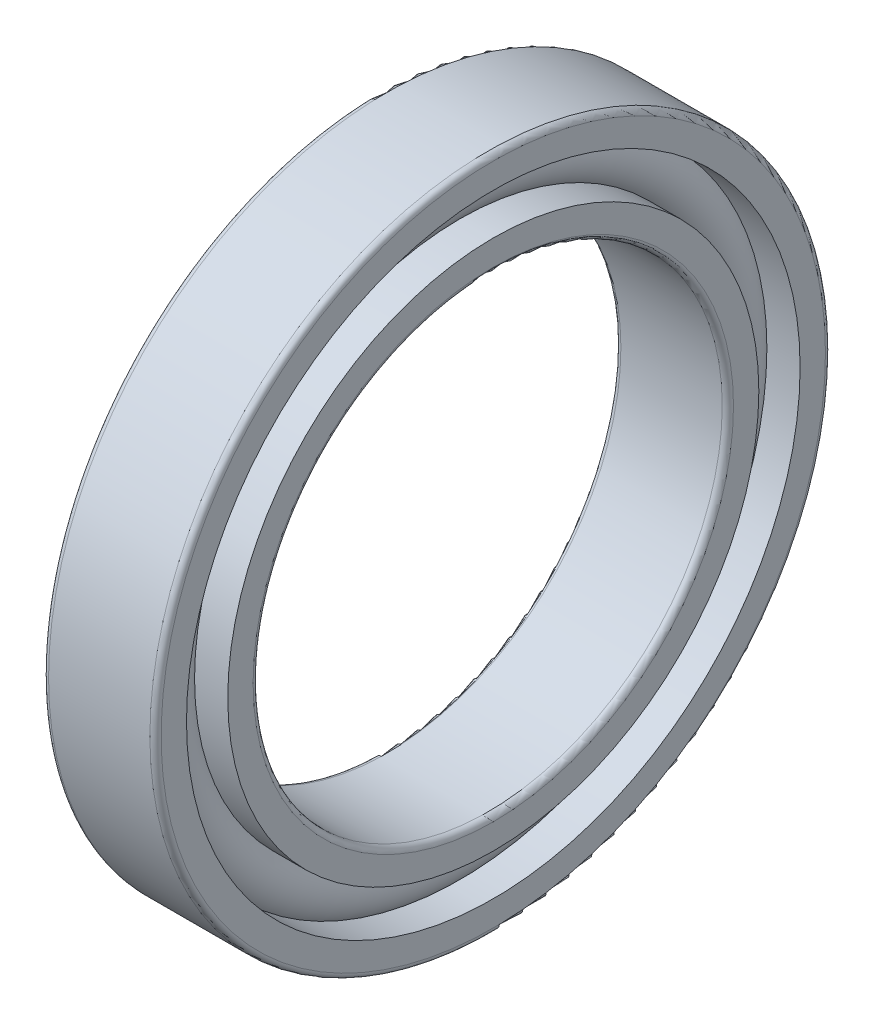
ISO-10303-21;
HEADER;
FILE_DESCRIPTION(('STEP AP214'),'2;1');
FILE_NAME('part.step','',(''),(''),'','','');
FILE_SCHEMA(('AUTOMOTIVE_DESIGN { 1 0 10303 214 1 1 1 1 }'));
ENDSEC;
DATA;
#1=APPLICATION_CONTEXT('core data for automotive mechanical design processes');
#2=APPLICATION_PROTOCOL_DEFINITION('international standard','automotive_design',2000,#1);
#3=PRODUCT_CONTEXT('',#1,'mechanical');
#4=PRODUCT('Part','Part','',(#3));
#5=PRODUCT_RELATED_PRODUCT_CATEGORY('part','',(#4));
#6=PRODUCT_DEFINITION_FORMATION('','',#4);
#7=PRODUCT_DEFINITION_CONTEXT('part definition',#1,'design');
#8=PRODUCT_DEFINITION('design','',#6,#7);
#9=PRODUCT_DEFINITION_SHAPE('','',#8);
#10=(LENGTH_UNIT() NAMED_UNIT(*) SI_UNIT(.MILLI.,.METRE.));
#11=(NAMED_UNIT(*) PLANE_ANGLE_UNIT() SI_UNIT($,.RADIAN.));
#12=(NAMED_UNIT(*) SI_UNIT($,.STERADIAN.) SOLID_ANGLE_UNIT());
#13=UNCERTAINTY_MEASURE_WITH_UNIT(LENGTH_MEASURE(1.E-05),#10,'distance_accuracy_value','');
#14=(GEOMETRIC_REPRESENTATION_CONTEXT(3) GLOBAL_UNCERTAINTY_ASSIGNED_CONTEXT((#13)) GLOBAL_UNIT_ASSIGNED_CONTEXT((#10,
#11,#12)) REPRESENTATION_CONTEXT('',''));
#15=CARTESIAN_POINT('',(0.,0.,0.));
#16=DIRECTION('',(0.,0.,1.));
#17=DIRECTION('',(1.,0.,0.));
#18=AXIS2_PLACEMENT_3D('',#15,#16,#17);
#19=CARTESIAN_POINT('',(0.,0.,0.));
#20=DIRECTION('',(-1.,0.,0.));
#21=DIRECTION('',(0.,0.,1.));
#22=AXIS2_PLACEMENT_3D('',#19,#20,#21);
#23=TOROIDAL_SURFACE('',#22,30.5,3.3);
#24=CARTESIAN_POINT('',(2.45967477524976,0.,0.));
#25=DIRECTION('',(-1.,0.,0.));
#26=DIRECTION('',(0.,0.,1.));
#27=AXIS2_PLACEMENT_3D('',#24,#25,#26);
#28=CIRCLE('',#27,32.7);
#29=CARTESIAN_POINT('',(2.45967477524976,0.,32.7));
#30=VERTEX_POINT('',#29);
#31=EDGE_CURVE('E36',#30,#30,#28,.F.);
#32=ORIENTED_EDGE('',*,*,#31,.T.);
#33=EDGE_LOOP('',(#32));
#34=FACE_BOUND('',#33,.T.);
#35=CARTESIAN_POINT('',(2.45967477524977,0.,0.));
#36=DIRECTION('',(-1.,0.,0.));
#37=DIRECTION('',(0.,0.,1.));
#38=AXIS2_PLACEMENT_3D('',#35,#36,#37);
#39=CIRCLE('',#38,28.3);
#40=CARTESIAN_POINT('',(2.45967477524977,0.,28.3));
#41=VERTEX_POINT('',#40);
#42=EDGE_CURVE('E10',#41,#41,#39,.T.);
#43=ORIENTED_EDGE('',*,*,#42,.T.);
#44=EDGE_LOOP('',(#43));
#45=FACE_BOUND('',#44,.T.);
#46=ADVANCED_FACE('F32',(#34,#45),#23,.T.);
#47=CARTESIAN_POINT('',(-20.6375,0.,0.));
#48=DIRECTION('',(1.,0.,0.));
#49=DIRECTION('',(0.,0.,-1.));
#50=AXIS2_PLACEMENT_3D('',#47,#48,#49);
#51=CYLINDRICAL_SURFACE('',#50,28.3);
#52=CARTESIAN_POINT('',(6.,0.,0.));
#53=DIRECTION('',(1.,0.,0.));
#54=DIRECTION('',(0.,0.,-1.));
#55=AXIS2_PLACEMENT_3D('',#52,#53,#54);
#56=CIRCLE('',#55,28.3);
#57=CARTESIAN_POINT('',(6.,0.,-28.3));
#58=VERTEX_POINT('',#57);
#59=EDGE_CURVE('E45',#58,#58,#56,.T.);
#60=ORIENTED_EDGE('',*,*,#59,.F.);
#61=EDGE_LOOP('',(#60));
#62=FACE_BOUND('',#61,.T.);
#63=ORIENTED_EDGE('',*,*,#42,.F.);
#64=EDGE_LOOP('',(#63));
#65=FACE_BOUND('',#64,.T.);
#66=ADVANCED_FACE('F84',(#62,#65),#51,.T.);
#67=CARTESIAN_POINT('',(-20.6375,0.,0.));
#68=DIRECTION('',(1.,0.,0.));
#69=DIRECTION('',(0.,0.,-1.));
#70=AXIS2_PLACEMENT_3D('',#67,#68,#69);
#71=CYLINDRICAL_SURFACE('',#70,28.3);
#72=CARTESIAN_POINT('',(-6.,0.,0.));
#73=DIRECTION('',(1.,0.,0.));
#74=DIRECTION('',(0.,0.,-1.));
#75=AXIS2_PLACEMENT_3D('',#72,#73,#74);
#76=CIRCLE('',#75,28.3);
#77=CARTESIAN_POINT('',(-6.,0.,-28.3));
#78=VERTEX_POINT('',#77);
#79=EDGE_CURVE('E54',#78,#78,#76,.T.);
#80=ORIENTED_EDGE('',*,*,#79,.T.);
#81=EDGE_LOOP('',(#80));
#82=FACE_BOUND('',#81,.T.);
#83=CARTESIAN_POINT('',(-2.45967477524977,0.,0.));
#84=DIRECTION('',(1.,0.,0.));
#85=DIRECTION('',(0.,0.,-1.));
#86=AXIS2_PLACEMENT_3D('',#83,#84,#85);
#87=CIRCLE('',#86,28.3);
#88=CARTESIAN_POINT('',(-2.45967477524977,0.,-28.3));
#89=VERTEX_POINT('',#88);
#90=EDGE_CURVE('E40',#89,#89,#87,.T.);
#91=ORIENTED_EDGE('',*,*,#90,.F.);
#92=EDGE_LOOP('',(#91));
#93=FACE_BOUND('',#92,.T.);
#94=ADVANCED_FACE('F87',(#82,#93),#71,.T.);
#95=CARTESIAN_POINT('',(6.,25.6,0.));
#96=DIRECTION('',(1.,0.,0.));
#97=DIRECTION('',(0.,0.,-1.));
#98=AXIS2_PLACEMENT_3D('',#95,#96,#97);
#99=PLANE('',#98);
#100=ORIENTED_EDGE('',*,*,#59,.T.);
#101=EDGE_LOOP('',(#100));
#102=FACE_BOUND('',#101,.T.);
#103=CARTESIAN_POINT('',(6.,0.,0.));
#104=DIRECTION('',(1.,0.,0.));
#105=DIRECTION('',(0.,0.,-1.));
#106=AXIS2_PLACEMENT_3D('',#103,#104,#105);
#107=CIRCLE('',#106,25.6);
#108=CARTESIAN_POINT('',(6.,0.,-25.6));
#109=VERTEX_POINT('',#108);
#110=EDGE_CURVE('E76',#109,#109,#107,.T.);
#111=ORIENTED_EDGE('',*,*,#110,.F.);
#112=EDGE_LOOP('',(#111));
#113=FACE_BOUND('',#112,.T.);
#114=ADVANCED_FACE('F81',(#102,#113),#99,.T.);
#115=CARTESIAN_POINT('',(5.4,0.,0.));
#116=DIRECTION('',(1.,0.,0.));
#117=DIRECTION('',(0.,0.,-1.));
#118=AXIS2_PLACEMENT_3D('',#115,#116,#117);
#119=TOROIDAL_SURFACE('',#118,25.6,0.6);
#120=ORIENTED_EDGE('',*,*,#110,.T.);
#121=EDGE_LOOP('',(#120));
#122=FACE_BOUND('',#121,.T.);
#123=CARTESIAN_POINT('',(5.4,0.,0.));
#124=DIRECTION('',(1.,0.,0.));
#125=DIRECTION('',(0.,0.,-1.));
#126=AXIS2_PLACEMENT_3D('',#123,#124,#125);
#127=CIRCLE('',#126,25.);
#128=CARTESIAN_POINT('',(5.4,0.,-25.));
#129=VERTEX_POINT('',#128);
#130=EDGE_CURVE('E73',#129,#129,#127,.T.);
#131=ORIENTED_EDGE('',*,*,#130,.F.);
#132=EDGE_LOOP('',(#131));
#133=FACE_BOUND('',#132,.T.);
#134=ADVANCED_FACE('F98',(#122,#133),#119,.T.);
#135=CARTESIAN_POINT('',(-20.6375,0.,0.));
#136=DIRECTION('',(1.,0.,0.));
#137=DIRECTION('',(0.,0.,-1.));
#138=AXIS2_PLACEMENT_3D('',#135,#136,#137);
#139=CYLINDRICAL_SURFACE('',#138,25.);
#140=ORIENTED_EDGE('',*,*,#130,.T.);
#141=EDGE_LOOP('',(#140));
#142=FACE_BOUND('',#141,.T.);
#143=CARTESIAN_POINT('',(-5.4,0.,0.));
#144=DIRECTION('',(1.,0.,0.));
#145=DIRECTION('',(0.,0.,-1.));
#146=AXIS2_PLACEMENT_3D('',#143,#144,#145);
#147=CIRCLE('',#146,25.);
#148=CARTESIAN_POINT('',(-5.4,0.,-25.));
#149=VERTEX_POINT('',#148);
#150=EDGE_CURVE('E70',#149,#149,#147,.T.);
#151=ORIENTED_EDGE('',*,*,#150,.F.);
#152=EDGE_LOOP('',(#151));
#153=FACE_BOUND('',#152,.T.);
#154=ADVANCED_FACE('F101',(#142,#153),#139,.F.);
#155=CARTESIAN_POINT('',(-5.4,0.,0.));
#156=DIRECTION('',(1.,0.,0.));
#157=DIRECTION('',(0.,0.,-1.));
#158=AXIS2_PLACEMENT_3D('',#155,#156,#157);
#159=TOROIDAL_SURFACE('',#158,25.6,0.6);
#160=ORIENTED_EDGE('',*,*,#150,.T.);
#161=EDGE_LOOP('',(#160));
#162=FACE_BOUND('',#161,.T.);
#163=CARTESIAN_POINT('',(-6.,0.,0.));
#164=DIRECTION('',(1.,0.,0.));
#165=DIRECTION('',(0.,0.,-1.));
#166=AXIS2_PLACEMENT_3D('',#163,#164,#165);
#167=CIRCLE('',#166,25.6);
#168=CARTESIAN_POINT('',(-6.,0.,-25.6));
#169=VERTEX_POINT('',#168);
#170=EDGE_CURVE('E67',#169,#169,#167,.T.);
#171=ORIENTED_EDGE('',*,*,#170,.F.);
#172=EDGE_LOOP('',(#171));
#173=FACE_BOUND('',#172,.T.);
#174=ADVANCED_FACE('F105',(#162,#173),#159,.T.);
#175=CARTESIAN_POINT('',(-6.,28.3,0.));
#176=DIRECTION('',(-1.,0.,0.));
#177=DIRECTION('',(0.,0.,1.));
#178=AXIS2_PLACEMENT_3D('',#175,#176,#177);
#179=PLANE('',#178);
#180=ORIENTED_EDGE('',*,*,#170,.T.);
#181=EDGE_LOOP('',(#180));
#182=FACE_BOUND('',#181,.T.);
#183=ORIENTED_EDGE('',*,*,#79,.F.);
#184=EDGE_LOOP('',(#183));
#185=FACE_BOUND('',#184,.T.);
#186=ADVANCED_FACE('F109',(#182,#185),#179,.T.);
#187=CARTESIAN_POINT('',(-2.45967477524976,0.,0.));
#188=DIRECTION('',(1.,0.,0.));
#189=DIRECTION('',(0.,0.,-1.));
#190=AXIS2_PLACEMENT_3D('',#187,#188,#189);
#191=CIRCLE('',#190,32.7);
#192=CARTESIAN_POINT('',(-2.45967477524976,0.,-32.7));
#193=VERTEX_POINT('',#192);
#194=EDGE_CURVE('E48',#193,#193,#191,.F.);
#195=ORIENTED_EDGE('',*,*,#194,.T.);
#196=EDGE_LOOP('',(#195));
#197=FACE_BOUND('',#196,.T.);
#198=ORIENTED_EDGE('',*,*,#90,.T.);
#199=EDGE_LOOP('',(#198));
#200=FACE_BOUND('',#199,.T.);
#201=ADVANCED_FACE('F34',(#197,#200),#23,.T.);
#202=CARTESIAN_POINT('',(-20.6375,0.,0.));
#203=DIRECTION('',(1.,0.,0.));
#204=DIRECTION('',(0.,0.,-1.));
#205=AXIS2_PLACEMENT_3D('',#202,#203,#204);
#206=CYLINDRICAL_SURFACE('',#205,32.7);
#207=CARTESIAN_POINT('',(6.,0.,0.));
#208=DIRECTION('',(1.,0.,0.));
#209=DIRECTION('',(0.,0.,-1.));
#210=AXIS2_PLACEMENT_3D('',#207,#208,#209);
#211=CIRCLE('',#210,32.7);
#212=CARTESIAN_POINT('',(6.,0.,-32.7));
#213=VERTEX_POINT('',#212);
#214=EDGE_CURVE('E50',#213,#213,#211,.T.);
#215=ORIENTED_EDGE('',*,*,#214,.T.);
#216=EDGE_LOOP('',(#215));
#217=FACE_BOUND('',#216,.T.);
#218=ORIENTED_EDGE('',*,*,#31,.F.);
#219=EDGE_LOOP('',(#218));
#220=FACE_BOUND('',#219,.T.);
#221=ADVANCED_FACE('F114',(#217,#220),#206,.F.);
#222=CARTESIAN_POINT('',(-20.6375,0.,0.));
#223=DIRECTION('',(1.,0.,0.));
#224=DIRECTION('',(0.,0.,-1.));
#225=AXIS2_PLACEMENT_3D('',#222,#223,#224);
#226=CYLINDRICAL_SURFACE('',#225,32.7);
#227=CARTESIAN_POINT('',(-6.,0.,0.));
#228=DIRECTION('',(1.,0.,0.));
#229=DIRECTION('',(0.,0.,-1.));
#230=AXIS2_PLACEMENT_3D('',#227,#228,#229);
#231=CIRCLE('',#230,32.7);
#232=CARTESIAN_POINT('',(-6.,0.,-32.7));
#233=VERTEX_POINT('',#232);
#234=EDGE_CURVE('E145',#233,#233,#231,.T.);
#235=ORIENTED_EDGE('',*,*,#234,.F.);
#236=EDGE_LOOP('',(#235));
#237=FACE_BOUND('',#236,.T.);
#238=ORIENTED_EDGE('',*,*,#194,.F.);
#239=EDGE_LOOP('',(#238));
#240=FACE_BOUND('',#239,.T.);
#241=ADVANCED_FACE('F117',(#237,#240),#226,.F.);
#242=CARTESIAN_POINT('',(6.,35.4,0.));
#243=DIRECTION('',(1.,0.,0.));
#244=DIRECTION('',(0.,0.,-1.));
#245=AXIS2_PLACEMENT_3D('',#242,#243,#244);
#246=PLANE('',#245);
#247=CARTESIAN_POINT('',(6.,0.,0.));
#248=DIRECTION('',(1.,0.,0.));
#249=DIRECTION('',(0.,0.,-1.));
#250=AXIS2_PLACEMENT_3D('',#247,#248,#249);
#251=CIRCLE('',#250,35.4);
#252=CARTESIAN_POINT('',(6.,0.,-35.4));
#253=VERTEX_POINT('',#252);
#254=EDGE_CURVE('E56',#253,#253,#251,.T.);
#255=ORIENTED_EDGE('',*,*,#254,.T.);
#256=EDGE_LOOP('',(#255));
#257=FACE_BOUND('',#256,.T.);
#258=ORIENTED_EDGE('',*,*,#214,.F.);
#259=EDGE_LOOP('',(#258));
#260=FACE_BOUND('',#259,.T.);
#261=ADVANCED_FACE('F118',(#257,#260),#246,.T.);
#262=CARTESIAN_POINT('',(5.4,0.,0.));
#263=DIRECTION('',(1.,0.,0.));
#264=DIRECTION('',(0.,0.,-1.));
#265=AXIS2_PLACEMENT_3D('',#262,#263,#264);
#266=TOROIDAL_SURFACE('',#265,35.4,0.600000000000001);
#267=CARTESIAN_POINT('',(5.4,0.,0.));
#268=DIRECTION('',(1.,0.,0.));
#269=DIRECTION('',(0.,0.,-1.));
#270=AXIS2_PLACEMENT_3D('',#267,#268,#269);
#271=CIRCLE('',#270,36.);
#272=CARTESIAN_POINT('',(5.4,0.,-36.));
#273=VERTEX_POINT('',#272);
#274=EDGE_CURVE('E61',#273,#273,#271,.T.);
#275=ORIENTED_EDGE('',*,*,#274,.T.);
#276=EDGE_LOOP('',(#275));
#277=FACE_BOUND('',#276,.T.);
#278=ORIENTED_EDGE('',*,*,#254,.F.);
#279=EDGE_LOOP('',(#278));
#280=FACE_BOUND('',#279,.T.);
#281=ADVANCED_FACE('F121',(#277,#280),#266,.T.);
#282=CARTESIAN_POINT('',(-20.6375,0.,0.));
#283=DIRECTION('',(1.,0.,0.));
#284=DIRECTION('',(0.,0.,-1.));
#285=AXIS2_PLACEMENT_3D('',#282,#283,#284);
#286=CYLINDRICAL_SURFACE('',#285,36.);
#287=CARTESIAN_POINT('',(-5.4,0.,0.));
#288=DIRECTION('',(1.,0.,0.));
#289=DIRECTION('',(0.,0.,-1.));
#290=AXIS2_PLACEMENT_3D('',#287,#288,#289);
#291=CIRCLE('',#290,36.);
#292=CARTESIAN_POINT('',(-5.4,0.,-36.));
#293=VERTEX_POINT('',#292);
#294=EDGE_CURVE('E149',#293,#293,#291,.T.);
#295=ORIENTED_EDGE('',*,*,#294,.T.);
#296=EDGE_LOOP('',(#295));
#297=FACE_BOUND('',#296,.T.);
#298=ORIENTED_EDGE('',*,*,#274,.F.);
#299=EDGE_LOOP('',(#298));
#300=FACE_BOUND('',#299,.T.);
#301=ADVANCED_FACE('F125',(#297,#300),#286,.T.);
#302=CARTESIAN_POINT('',(-5.4,0.,0.));
#303=DIRECTION('',(1.,0.,0.));
#304=DIRECTION('',(0.,0.,-1.));
#305=AXIS2_PLACEMENT_3D('',#302,#303,#304);
#306=TOROIDAL_SURFACE('',#305,35.4,0.600000000000001);
#307=CARTESIAN_POINT('',(-6.,0.,0.));
#308=DIRECTION('',(1.,0.,0.));
#309=DIRECTION('',(0.,0.,-1.));
#310=AXIS2_PLACEMENT_3D('',#307,#308,#309);
#311=CIRCLE('',#310,35.4);
#312=CARTESIAN_POINT('',(-6.,0.,-35.4));
#313=VERTEX_POINT('',#312);
#314=EDGE_CURVE('E146',#313,#313,#311,.T.);
#315=ORIENTED_EDGE('',*,*,#314,.T.);
#316=EDGE_LOOP('',(#315));
#317=FACE_BOUND('',#316,.T.);
#318=ORIENTED_EDGE('',*,*,#294,.F.);
#319=EDGE_LOOP('',(#318));
#320=FACE_BOUND('',#319,.T.);
#321=ADVANCED_FACE('F129',(#317,#320),#306,.T.);
#322=CARTESIAN_POINT('',(-6.,32.7,0.));
#323=DIRECTION('',(-1.,0.,0.));
#324=DIRECTION('',(0.,0.,1.));
#325=AXIS2_PLACEMENT_3D('',#322,#323,#324);
#326=PLANE('',#325);
#327=ORIENTED_EDGE('',*,*,#234,.T.);
#328=EDGE_LOOP('',(#327));
#329=FACE_BOUND('',#328,.T.);
#330=ORIENTED_EDGE('',*,*,#314,.F.);
#331=EDGE_LOOP('',(#330));
#332=FACE_BOUND('',#331,.T.);
#333=ADVANCED_FACE('F133',(#329,#332),#326,.T.);
#334=CLOSED_SHELL('',(#46,#66,#94,#114,#134,#154,#174,#186,#201,#221,#241,#261,#281,#301,#321,#333));
#335=MANIFOLD_SOLID_BREP('B2',#334);
#336=ADVANCED_BREP_SHAPE_REPRESENTATION('',(#18,#335),#14);
#337=SHAPE_DEFINITION_REPRESENTATION(#9,#336);
ENDSEC;
END-ISO-10303-21;
